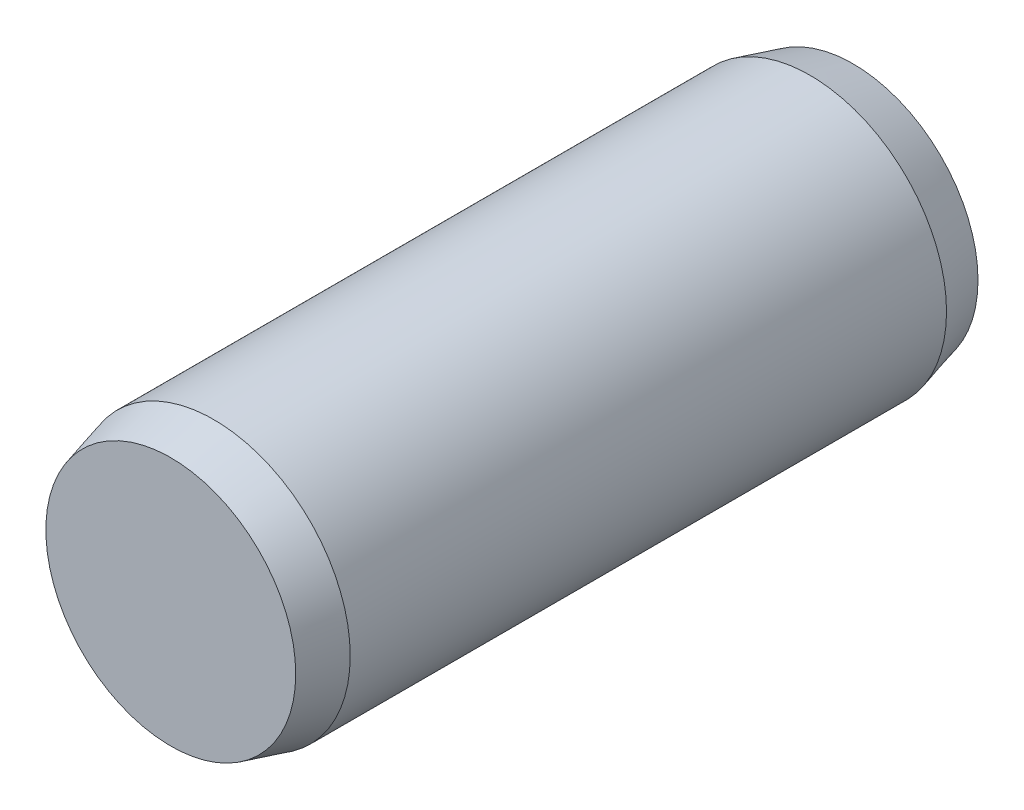
ISO-10303-21;
HEADER;
FILE_DESCRIPTION(('STEP AP214'),'2;1');
FILE_NAME('part.step','',(''),(''),'','','');
FILE_SCHEMA(('AUTOMOTIVE_DESIGN { 1 0 10303 214 1 1 1 1 }'));
ENDSEC;
DATA;
#1=APPLICATION_CONTEXT('core data for automotive mechanical design processes');
#2=APPLICATION_PROTOCOL_DEFINITION('international standard','automotive_design',2000,#1);
#3=PRODUCT_CONTEXT('',#1,'mechanical');
#4=PRODUCT('Part','Part','',(#3));
#5=PRODUCT_RELATED_PRODUCT_CATEGORY('part','',(#4));
#6=PRODUCT_DEFINITION_FORMATION('','',#4);
#7=PRODUCT_DEFINITION_CONTEXT('part definition',#1,'design');
#8=PRODUCT_DEFINITION('design','',#6,#7);
#9=PRODUCT_DEFINITION_SHAPE('','',#8);
#10=(LENGTH_UNIT() NAMED_UNIT(*) SI_UNIT(.MILLI.,.METRE.));
#11=(NAMED_UNIT(*) PLANE_ANGLE_UNIT() SI_UNIT($,.RADIAN.));
#12=(NAMED_UNIT(*) SI_UNIT($,.STERADIAN.) SOLID_ANGLE_UNIT());
#13=UNCERTAINTY_MEASURE_WITH_UNIT(LENGTH_MEASURE(1.E-05),#10,'distance_accuracy_value','');
#14=(GEOMETRIC_REPRESENTATION_CONTEXT(3) GLOBAL_UNCERTAINTY_ASSIGNED_CONTEXT((#13)) GLOBAL_UNIT_ASSIGNED_CONTEXT((#10,
#11,#12)) REPRESENTATION_CONTEXT('',''));
#15=CARTESIAN_POINT('',(0.,0.,0.));
#16=DIRECTION('',(0.,0.,1.));
#17=DIRECTION('',(1.,0.,0.));
#18=AXIS2_PLACEMENT_3D('',#15,#16,#17);
#19=CARTESIAN_POINT('',(0.,0.,4.37));
#20=DIRECTION('',(0.,0.,-1.));
#21=DIRECTION('',(-1.,0.,0.));
#22=AXIS2_PLACEMENT_3D('',#19,#20,#21);
#23=CONICAL_SURFACE('',#22,2.,0.26179938779915);
#24=CARTESIAN_POINT('',(0.,0.,5.));
#25=DIRECTION('',(0.,0.,1.));
#26=DIRECTION('',(1.,0.,0.));
#27=AXIS2_PLACEMENT_3D('',#24,#25,#26);
#28=CIRCLE('',#27,1.83119200876839);
#29=CARTESIAN_POINT('',(1.83119200876839,0.,5.));
#30=VERTEX_POINT('',#29);
#31=EDGE_CURVE('E46',#30,#30,#28,.T.);
#32=ORIENTED_EDGE('',*,*,#31,.F.);
#33=EDGE_LOOP('',(#32));
#34=FACE_BOUND('',#33,.T.);
#35=CARTESIAN_POINT('',(0.,0.,4.37));
#36=DIRECTION('',(0.,0.,1.));
#37=DIRECTION('',(1.,0.,0.));
#38=AXIS2_PLACEMENT_3D('',#35,#36,#37);
#39=CIRCLE('',#38,2.);
#40=CARTESIAN_POINT('',(2.,0.,4.37));
#41=VERTEX_POINT('',#40);
#42=EDGE_CURVE('E10',#41,#41,#39,.T.);
#43=ORIENTED_EDGE('',*,*,#42,.T.);
#44=EDGE_LOOP('',(#43));
#45=FACE_BOUND('',#44,.T.);
#46=ADVANCED_FACE('F32',(#34,#45),#23,.T.);
#47=CARTESIAN_POINT('',(0.,0.,5.));
#48=DIRECTION('',(0.,0.,1.));
#49=DIRECTION('',(1.,0.,0.));
#50=AXIS2_PLACEMENT_3D('',#47,#48,#49);
#51=CYLINDRICAL_SURFACE('',#50,2.);
#52=ORIENTED_EDGE('',*,*,#42,.F.);
#53=EDGE_LOOP('',(#52));
#54=FACE_BOUND('',#53,.T.);
#55=CARTESIAN_POINT('',(0.,0.,-4.37));
#56=DIRECTION('',(0.,0.,1.));
#57=DIRECTION('',(1.,0.,0.));
#58=AXIS2_PLACEMENT_3D('',#55,#56,#57);
#59=CIRCLE('',#58,2.);
#60=CARTESIAN_POINT('',(2.,0.,-4.37));
#61=VERTEX_POINT('',#60);
#62=EDGE_CURVE('E38',#61,#61,#59,.T.);
#63=ORIENTED_EDGE('',*,*,#62,.T.);
#64=EDGE_LOOP('',(#63));
#65=FACE_BOUND('',#64,.T.);
#66=ADVANCED_FACE('F55',(#54,#65),#51,.T.);
#67=CARTESIAN_POINT('',(0.,0.,-5.));
#68=DIRECTION('',(0.,0.,1.));
#69=DIRECTION('',(1.,0.,0.));
#70=AXIS2_PLACEMENT_3D('',#67,#68,#69);
#71=CONICAL_SURFACE('',#70,1.83119200876839,0.26179938779915);
#72=ORIENTED_EDGE('',*,*,#62,.F.);
#73=EDGE_LOOP('',(#72));
#74=FACE_BOUND('',#73,.T.);
#75=CARTESIAN_POINT('',(0.,0.,-5.));
#76=DIRECTION('',(0.,0.,1.));
#77=DIRECTION('',(1.,0.,0.));
#78=AXIS2_PLACEMENT_3D('',#75,#76,#77);
#79=CIRCLE('',#78,1.83119200876839);
#80=CARTESIAN_POINT('',(1.83119200876839,0.,-5.));
#81=VERTEX_POINT('',#80);
#82=EDGE_CURVE('E42',#81,#81,#79,.T.);
#83=ORIENTED_EDGE('',*,*,#82,.T.);
#84=EDGE_LOOP('',(#83));
#85=FACE_BOUND('',#84,.T.);
#86=ADVANCED_FACE('F59',(#74,#85),#71,.T.);
#87=CARTESIAN_POINT('',(0.,1.83119200876839,-5.));
#88=DIRECTION('',(0.,0.,1.));
#89=DIRECTION('',(1.,0.,0.));
#90=AXIS2_PLACEMENT_3D('',#87,#88,#89);
#91=PLANE('',#90);
#92=ORIENTED_EDGE('',*,*,#82,.F.);
#93=EDGE_LOOP('',(#92));
#94=FACE_BOUND('',#93,.T.);
#95=ADVANCED_FACE('F64',(#94),#91,.F.);
#96=CARTESIAN_POINT('',(0.,0.,5.));
#97=DIRECTION('',(0.,0.,-1.));
#98=DIRECTION('',(-1.,0.,0.));
#99=AXIS2_PLACEMENT_3D('',#96,#97,#98);
#100=PLANE('',#99);
#101=ORIENTED_EDGE('',*,*,#31,.T.);
#102=EDGE_LOOP('',(#101));
#103=FACE_BOUND('',#102,.T.);
#104=ADVANCED_FACE('F52',(#103),#100,.F.);
#105=CLOSED_SHELL('',(#46,#66,#86,#95,#104));
#106=MANIFOLD_SOLID_BREP('B2',#105);
#107=ADVANCED_BREP_SHAPE_REPRESENTATION('',(#18,#106),#14);
#108=SHAPE_DEFINITION_REPRESENTATION(#9,#107);
ENDSEC;
END-ISO-10303-21;
